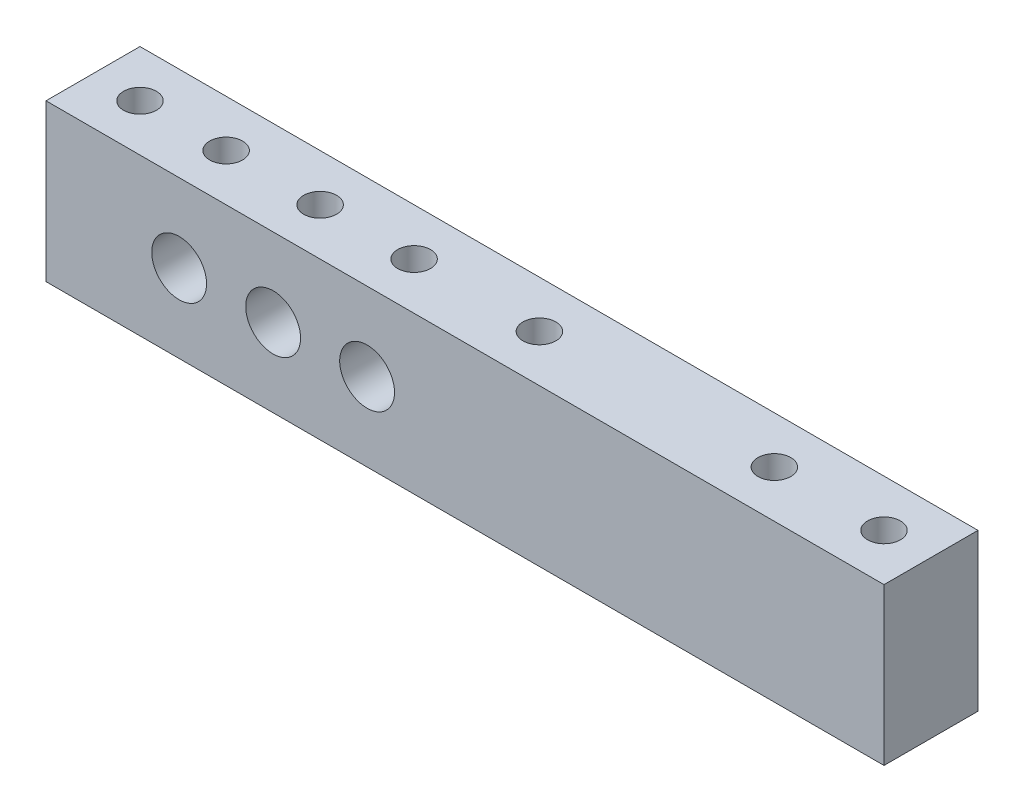
ISO-10303-21;
HEADER;
FILE_DESCRIPTION(('STEP AP214'),'2;1');
FILE_NAME('part.step','',(''),(''),'','','');
FILE_SCHEMA(('AUTOMOTIVE_DESIGN { 1 0 10303 214 1 1 1 1 }'));
ENDSEC;
DATA;
#1=APPLICATION_CONTEXT('core data for automotive mechanical design processes');
#2=APPLICATION_PROTOCOL_DEFINITION('international standard','automotive_design',2000,#1);
#3=PRODUCT_CONTEXT('',#1,'mechanical');
#4=PRODUCT('Part','Part','',(#3));
#5=PRODUCT_RELATED_PRODUCT_CATEGORY('part','',(#4));
#6=PRODUCT_DEFINITION_FORMATION('','',#4);
#7=PRODUCT_DEFINITION_CONTEXT('part definition',#1,'design');
#8=PRODUCT_DEFINITION('design','',#6,#7);
#9=PRODUCT_DEFINITION_SHAPE('','',#8);
#10=(LENGTH_UNIT() NAMED_UNIT(*) SI_UNIT(.MILLI.,.METRE.));
#11=(NAMED_UNIT(*) PLANE_ANGLE_UNIT() SI_UNIT($,.RADIAN.));
#12=(NAMED_UNIT(*) SI_UNIT($,.STERADIAN.) SOLID_ANGLE_UNIT());
#13=UNCERTAINTY_MEASURE_WITH_UNIT(LENGTH_MEASURE(1.E-05),#10,'distance_accuracy_value','');
#14=(GEOMETRIC_REPRESENTATION_CONTEXT(3) GLOBAL_UNCERTAINTY_ASSIGNED_CONTEXT((#13)) GLOBAL_UNIT_ASSIGNED_CONTEXT((#10,
#11,#12)) REPRESENTATION_CONTEXT('',''));
#15=CARTESIAN_POINT('',(0.,0.,0.));
#16=DIRECTION('',(0.,0.,1.));
#17=DIRECTION('',(1.,0.,0.));
#18=AXIS2_PLACEMENT_3D('',#15,#16,#17);
#19=CARTESIAN_POINT('',(0.,0.,12.));
#20=DIRECTION('',(0.,0.,-1.));
#21=DIRECTION('',(-1.,0.,0.));
#22=AXIS2_PLACEMENT_3D('',#19,#20,#21);
#23=PLANE('',#22);
#24=CARTESIAN_POINT('',(29.,10.,12.));
#25=DIRECTION('',(0.,0.,1.));
#26=DIRECTION('',(1.,0.,0.));
#27=AXIS2_PLACEMENT_3D('',#24,#25,#26);
#28=CIRCLE('',#27,3.49999999999999);
#29=CARTESIAN_POINT('',(32.5,10.,12.));
#30=VERTEX_POINT('',#29);
#31=EDGE_CURVE('E245',#30,#30,#28,.T.);
#32=ORIENTED_EDGE('',*,*,#31,.F.);
#33=EDGE_LOOP('',(#32));
#34=FACE_BOUND('',#33,.T.);
#35=CARTESIAN_POINT('',(41.,10.,12.));
#36=DIRECTION('',(0.,0.,1.));
#37=DIRECTION('',(1.,0.,0.));
#38=AXIS2_PLACEMENT_3D('',#35,#36,#37);
#39=CIRCLE('',#38,3.49999999999999);
#40=CARTESIAN_POINT('',(44.5,10.,12.));
#41=VERTEX_POINT('',#40);
#42=EDGE_CURVE('E253',#41,#41,#39,.T.);
#43=ORIENTED_EDGE('',*,*,#42,.F.);
#44=EDGE_LOOP('',(#43));
#45=FACE_BOUND('',#44,.T.);
#46=DIRECTION('',(0.,-1.,0.));
#47=VECTOR('',#46,1.);
#48=CARTESIAN_POINT('',(0.,0.,12.));
#49=LINE('',#48,#47);
#50=CARTESIAN_POINT('',(0.,20.,12.));
#51=VERTEX_POINT('',#50);
#52=CARTESIAN_POINT('',(0.,0.,12.));
#53=VERTEX_POINT('',#52);
#54=EDGE_CURVE('E105',#51,#53,#49,.T.);
#55=ORIENTED_EDGE('',*,*,#54,.T.);
#56=DIRECTION('',(1.,0.,0.));
#57=VECTOR('',#56,1.);
#58=CARTESIAN_POINT('',(0.,0.,12.));
#59=LINE('',#58,#57);
#60=CARTESIAN_POINT('',(107.,0.,12.));
#61=VERTEX_POINT('',#60);
#62=EDGE_CURVE('E100',#53,#61,#59,.T.);
#63=ORIENTED_EDGE('',*,*,#62,.T.);
#64=DIRECTION('',(0.,1.,0.));
#65=VECTOR('',#64,1.);
#66=CARTESIAN_POINT('',(107.,0.,12.));
#67=LINE('',#66,#65);
#68=CARTESIAN_POINT('',(107.,20.,12.));
#69=VERTEX_POINT('',#68);
#70=EDGE_CURVE('E103',#61,#69,#67,.T.);
#71=ORIENTED_EDGE('',*,*,#70,.T.);
#72=DIRECTION('',(-1.,0.,0.));
#73=VECTOR('',#72,1.);
#74=CARTESIAN_POINT('',(0.,20.,12.));
#75=LINE('',#74,#73);
#76=EDGE_CURVE('E70',#69,#51,#75,.T.);
#77=ORIENTED_EDGE('',*,*,#76,.T.);
#78=EDGE_LOOP('',(#55,#63,#71,#77));
#79=FACE_BOUND('',#78,.T.);
#80=CARTESIAN_POINT('',(17.,10.,12.));
#81=DIRECTION('',(0.,0.,1.));
#82=DIRECTION('',(1.,0.,0.));
#83=AXIS2_PLACEMENT_3D('',#80,#81,#82);
#84=CIRCLE('',#83,3.49999999999999);
#85=CARTESIAN_POINT('',(20.5,10.,12.));
#86=VERTEX_POINT('',#85);
#87=EDGE_CURVE('E230',#86,#86,#84,.T.);
#88=ORIENTED_EDGE('',*,*,#87,.F.);
#89=EDGE_LOOP('',(#88));
#90=FACE_BOUND('',#89,.T.);
#91=ADVANCED_FACE('F45',(#34,#45,#79,#90),#23,.F.);
#92=CARTESIAN_POINT('',(0.,0.,12.));
#93=DIRECTION('',(1.,0.,0.));
#94=DIRECTION('',(0.,0.,-1.));
#95=AXIS2_PLACEMENT_3D('',#92,#93,#94);
#96=PLANE('',#95);
#97=DIRECTION('',(0.,-1.,0.));
#98=VECTOR('',#97,1.);
#99=CARTESIAN_POINT('',(0.,0.,0.));
#100=LINE('',#99,#98);
#101=CARTESIAN_POINT('',(0.,20.,0.));
#102=VERTEX_POINT('',#101);
#103=CARTESIAN_POINT('',(0.,0.,0.));
#104=VERTEX_POINT('',#103);
#105=EDGE_CURVE('E122',#102,#104,#100,.T.);
#106=ORIENTED_EDGE('',*,*,#105,.T.);
#107=DIRECTION('',(0.,0.,-1.));
#108=VECTOR('',#107,1.);
#109=CARTESIAN_POINT('',(0.,0.,12.));
#110=LINE('',#109,#108);
#111=EDGE_CURVE('E11',#53,#104,#110,.T.);
#112=ORIENTED_EDGE('',*,*,#111,.F.);
#113=ORIENTED_EDGE('',*,*,#54,.F.);
#114=DIRECTION('',(0.,0.,-1.));
#115=VECTOR('',#114,1.);
#116=CARTESIAN_POINT('',(0.,20.,12.));
#117=LINE('',#116,#115);
#118=EDGE_CURVE('E118',#51,#102,#117,.T.);
#119=ORIENTED_EDGE('',*,*,#118,.T.);
#120=EDGE_LOOP('',(#106,#112,#113,#119));
#121=FACE_BOUND('',#120,.T.);
#122=ADVANCED_FACE('F47',(#121),#96,.F.);
#123=CARTESIAN_POINT('',(0.,0.,12.));
#124=DIRECTION('',(0.,1.,0.));
#125=DIRECTION('',(0.,0.,1.));
#126=AXIS2_PLACEMENT_3D('',#123,#124,#125);
#127=PLANE('',#126);
#128=CARTESIAN_POINT('',(6.00000000000001,0.,6.));
#129=DIRECTION('',(0.,1.,0.));
#130=DIRECTION('',(0.,0.,1.));
#131=AXIS2_PLACEMENT_3D('',#128,#129,#130);
#132=CIRCLE('',#131,2.09999999999999);
#133=CARTESIAN_POINT('',(6.00000000000001,0.,8.09999999999999));
#134=VERTEX_POINT('',#133);
#135=EDGE_CURVE('E217',#134,#134,#132,.T.);
#136=ORIENTED_EDGE('',*,*,#135,.T.);
#137=EDGE_LOOP('',(#136));
#138=FACE_BOUND('',#137,.T.);
#139=CARTESIAN_POINT('',(101.,0.,6.));
#140=DIRECTION('',(0.,1.,0.));
#141=DIRECTION('',(0.,0.,1.));
#142=AXIS2_PLACEMENT_3D('',#139,#140,#141);
#143=CIRCLE('',#142,2.09999999999999);
#144=CARTESIAN_POINT('',(101.,0.,8.09999999999999));
#145=VERTEX_POINT('',#144);
#146=EDGE_CURVE('E221',#145,#145,#143,.T.);
#147=ORIENTED_EDGE('',*,*,#146,.T.);
#148=EDGE_LOOP('',(#147));
#149=FACE_BOUND('',#148,.T.);
#150=CARTESIAN_POINT('',(87.,0.,6.));
#151=DIRECTION('',(0.,1.,0.));
#152=DIRECTION('',(0.,0.,1.));
#153=AXIS2_PLACEMENT_3D('',#150,#151,#152);
#154=CIRCLE('',#153,2.09999999999999);
#155=CARTESIAN_POINT('',(87.,0.,8.09999999999999));
#156=VERTEX_POINT('',#155);
#157=EDGE_CURVE('E225',#156,#156,#154,.T.);
#158=ORIENTED_EDGE('',*,*,#157,.T.);
#159=EDGE_LOOP('',(#158));
#160=FACE_BOUND('',#159,.T.);
#161=CARTESIAN_POINT('',(57.,0.,6.));
#162=DIRECTION('',(0.,1.,0.));
#163=DIRECTION('',(0.,0.,1.));
#164=AXIS2_PLACEMENT_3D('',#161,#162,#163);
#165=CIRCLE('',#164,2.09999999999999);
#166=CARTESIAN_POINT('',(57.,0.,8.09999999999999));
#167=VERTEX_POINT('',#166);
#168=EDGE_CURVE('E228',#167,#167,#165,.T.);
#169=ORIENTED_EDGE('',*,*,#168,.T.);
#170=EDGE_LOOP('',(#169));
#171=FACE_BOUND('',#170,.T.);
#172=DIRECTION('',(1.,0.,0.));
#173=VECTOR('',#172,1.);
#174=CARTESIAN_POINT('',(0.,0.,0.));
#175=LINE('',#174,#173);
#176=CARTESIAN_POINT('',(107.,0.,0.));
#177=VERTEX_POINT('',#176);
#178=EDGE_CURVE('E110',#104,#177,#175,.T.);
#179=ORIENTED_EDGE('',*,*,#178,.T.);
#180=DIRECTION('',(0.,0.,-1.));
#181=VECTOR('',#180,1.);
#182=CARTESIAN_POINT('',(107.,0.,12.));
#183=LINE('',#182,#181);
#184=EDGE_CURVE('E61',#61,#177,#183,.T.);
#185=ORIENTED_EDGE('',*,*,#184,.F.);
#186=ORIENTED_EDGE('',*,*,#62,.F.);
#187=ORIENTED_EDGE('',*,*,#111,.T.);
#188=EDGE_LOOP('',(#179,#185,#186,#187));
#189=FACE_BOUND('',#188,.T.);
#190=ADVANCED_FACE('F109',(#138,#149,#160,#171,#189),#127,.F.);
#191=CARTESIAN_POINT('',(107.,0.,12.));
#192=DIRECTION('',(-1.,0.,0.));
#193=DIRECTION('',(0.,0.,1.));
#194=AXIS2_PLACEMENT_3D('',#191,#192,#193);
#195=PLANE('',#194);
#196=DIRECTION('',(0.,1.,0.));
#197=VECTOR('',#196,1.);
#198=CARTESIAN_POINT('',(107.,0.,0.));
#199=LINE('',#198,#197);
#200=CARTESIAN_POINT('',(107.,20.,0.));
#201=VERTEX_POINT('',#200);
#202=EDGE_CURVE('E87',#177,#201,#199,.T.);
#203=ORIENTED_EDGE('',*,*,#202,.T.);
#204=DIRECTION('',(0.,0.,-1.));
#205=VECTOR('',#204,1.);
#206=CARTESIAN_POINT('',(107.,20.,12.));
#207=LINE('',#206,#205);
#208=EDGE_CURVE('E112',#69,#201,#207,.T.);
#209=ORIENTED_EDGE('',*,*,#208,.F.);
#210=ORIENTED_EDGE('',*,*,#70,.F.);
#211=ORIENTED_EDGE('',*,*,#184,.T.);
#212=EDGE_LOOP('',(#203,#209,#210,#211));
#213=FACE_BOUND('',#212,.T.);
#214=ADVANCED_FACE('F114',(#213),#195,.F.);
#215=CARTESIAN_POINT('',(0.,20.,12.));
#216=DIRECTION('',(0.,-1.,0.));
#217=DIRECTION('',(0.,0.,-1.));
#218=AXIS2_PLACEMENT_3D('',#215,#216,#217);
#219=PLANE('',#218);
#220=CARTESIAN_POINT('',(17.,20.,6.));
#221=DIRECTION('',(0.,1.,0.));
#222=DIRECTION('',(0.,0.,1.));
#223=AXIS2_PLACEMENT_3D('',#220,#221,#222);
#224=CIRCLE('',#223,2.09999999999999);
#225=CARTESIAN_POINT('',(17.,20.,8.09999999999999));
#226=VERTEX_POINT('',#225);
#227=EDGE_CURVE('E296',#226,#226,#224,.T.);
#228=ORIENTED_EDGE('',*,*,#227,.F.);
#229=EDGE_LOOP('',(#228));
#230=FACE_BOUND('',#229,.T.);
#231=CARTESIAN_POINT('',(29.,20.,6.));
#232=DIRECTION('',(0.,1.,0.));
#233=DIRECTION('',(0.,0.,1.));
#234=AXIS2_PLACEMENT_3D('',#231,#232,#233);
#235=CIRCLE('',#234,2.09999999999999);
#236=CARTESIAN_POINT('',(29.,20.,8.09999999999999));
#237=VERTEX_POINT('',#236);
#238=EDGE_CURVE('E292',#237,#237,#235,.T.);
#239=ORIENTED_EDGE('',*,*,#238,.F.);
#240=EDGE_LOOP('',(#239));
#241=FACE_BOUND('',#240,.T.);
#242=CARTESIAN_POINT('',(41.,20.,6.));
#243=DIRECTION('',(0.,1.,0.));
#244=DIRECTION('',(0.,0.,1.));
#245=AXIS2_PLACEMENT_3D('',#242,#243,#244);
#246=CIRCLE('',#245,2.09999999999999);
#247=CARTESIAN_POINT('',(41.,20.,8.09999999999999));
#248=VERTEX_POINT('',#247);
#249=EDGE_CURVE('E146',#248,#248,#246,.T.);
#250=ORIENTED_EDGE('',*,*,#249,.F.);
#251=EDGE_LOOP('',(#250));
#252=FACE_BOUND('',#251,.T.);
#253=CARTESIAN_POINT('',(6.00000000000001,20.,6.));
#254=DIRECTION('',(0.,1.,0.));
#255=DIRECTION('',(0.,0.,1.));
#256=AXIS2_PLACEMENT_3D('',#253,#254,#255);
#257=CIRCLE('',#256,2.09999999999999);
#258=CARTESIAN_POINT('',(6.00000000000001,20.,8.09999999999999));
#259=VERTEX_POINT('',#258);
#260=EDGE_CURVE('E145',#259,#259,#257,.T.);
#261=ORIENTED_EDGE('',*,*,#260,.F.);
#262=EDGE_LOOP('',(#261));
#263=FACE_BOUND('',#262,.T.);
#264=CARTESIAN_POINT('',(101.,20.,6.));
#265=DIRECTION('',(0.,1.,0.));
#266=DIRECTION('',(0.,0.,1.));
#267=AXIS2_PLACEMENT_3D('',#264,#265,#266);
#268=CIRCLE('',#267,2.09999999999999);
#269=CARTESIAN_POINT('',(101.,20.,8.09999999999999));
#270=VERTEX_POINT('',#269);
#271=EDGE_CURVE('E280',#270,#270,#268,.T.);
#272=ORIENTED_EDGE('',*,*,#271,.F.);
#273=EDGE_LOOP('',(#272));
#274=FACE_BOUND('',#273,.T.);
#275=CARTESIAN_POINT('',(87.,20.,6.));
#276=DIRECTION('',(0.,1.,0.));
#277=DIRECTION('',(0.,0.,1.));
#278=AXIS2_PLACEMENT_3D('',#275,#276,#277);
#279=CIRCLE('',#278,2.09999999999999);
#280=CARTESIAN_POINT('',(87.,20.,8.09999999999999));
#281=VERTEX_POINT('',#280);
#282=EDGE_CURVE('E274',#281,#281,#279,.T.);
#283=ORIENTED_EDGE('',*,*,#282,.F.);
#284=EDGE_LOOP('',(#283));
#285=FACE_BOUND('',#284,.T.);
#286=CARTESIAN_POINT('',(57.,20.,6.));
#287=DIRECTION('',(0.,1.,0.));
#288=DIRECTION('',(0.,0.,1.));
#289=AXIS2_PLACEMENT_3D('',#286,#287,#288);
#290=CIRCLE('',#289,2.09999999999999);
#291=CARTESIAN_POINT('',(57.,20.,8.09999999999999));
#292=VERTEX_POINT('',#291);
#293=EDGE_CURVE('E231',#292,#292,#290,.T.);
#294=ORIENTED_EDGE('',*,*,#293,.F.);
#295=EDGE_LOOP('',(#294));
#296=FACE_BOUND('',#295,.T.);
#297=DIRECTION('',(-1.,0.,0.));
#298=VECTOR('',#297,1.);
#299=CARTESIAN_POINT('',(0.,20.,0.));
#300=LINE('',#299,#298);
#301=EDGE_CURVE('E93',#201,#102,#300,.T.);
#302=ORIENTED_EDGE('',*,*,#301,.T.);
#303=ORIENTED_EDGE('',*,*,#118,.F.);
#304=ORIENTED_EDGE('',*,*,#76,.F.);
#305=ORIENTED_EDGE('',*,*,#208,.T.);
#306=EDGE_LOOP('',(#302,#303,#304,#305));
#307=FACE_BOUND('',#306,.T.);
#308=ADVANCED_FACE('F204',(#230,#241,#252,#263,#274,#285,#296,#307),#219,.F.);
#309=CARTESIAN_POINT('',(0.,0.,0.));
#310=DIRECTION('',(0.,0.,-1.));
#311=DIRECTION('',(-1.,0.,0.));
#312=AXIS2_PLACEMENT_3D('',#309,#310,#311);
#313=PLANE('',#312);
#314=CARTESIAN_POINT('',(17.,10.,0.));
#315=DIRECTION('',(0.,0.,-1.));
#316=DIRECTION('',(-1.,0.,0.));
#317=AXIS2_PLACEMENT_3D('',#314,#315,#316);
#318=CIRCLE('',#317,3.49999999999999);
#319=CARTESIAN_POINT('',(13.5,10.,0.));
#320=VERTEX_POINT('',#319);
#321=EDGE_CURVE('E236',#320,#320,#318,.T.);
#322=ORIENTED_EDGE('',*,*,#321,.F.);
#323=EDGE_LOOP('',(#322));
#324=FACE_BOUND('',#323,.T.);
#325=CARTESIAN_POINT('',(29.,10.,0.));
#326=DIRECTION('',(0.,0.,-1.));
#327=DIRECTION('',(-1.,0.,0.));
#328=AXIS2_PLACEMENT_3D('',#325,#326,#327);
#329=CIRCLE('',#328,3.49999999999999);
#330=CARTESIAN_POINT('',(25.5,10.,0.));
#331=VERTEX_POINT('',#330);
#332=EDGE_CURVE('E249',#331,#331,#329,.T.);
#333=ORIENTED_EDGE('',*,*,#332,.F.);
#334=EDGE_LOOP('',(#333));
#335=FACE_BOUND('',#334,.T.);
#336=CARTESIAN_POINT('',(41.,10.,0.));
#337=DIRECTION('',(0.,0.,-1.));
#338=DIRECTION('',(-1.,0.,0.));
#339=AXIS2_PLACEMENT_3D('',#336,#337,#338);
#340=CIRCLE('',#339,3.49999999999999);
#341=CARTESIAN_POINT('',(37.5,10.,0.));
#342=VERTEX_POINT('',#341);
#343=EDGE_CURVE('E126',#342,#342,#340,.T.);
#344=ORIENTED_EDGE('',*,*,#343,.F.);
#345=EDGE_LOOP('',(#344));
#346=FACE_BOUND('',#345,.T.);
#347=ORIENTED_EDGE('',*,*,#105,.F.);
#348=ORIENTED_EDGE('',*,*,#301,.F.);
#349=ORIENTED_EDGE('',*,*,#202,.F.);
#350=ORIENTED_EDGE('',*,*,#178,.F.);
#351=EDGE_LOOP('',(#347,#348,#349,#350));
#352=FACE_BOUND('',#351,.T.);
#353=ADVANCED_FACE('F189',(#324,#335,#346,#352),#313,.T.);
#354=CARTESIAN_POINT('',(41.,10.,12.));
#355=DIRECTION('',(0.,0.,1.));
#356=DIRECTION('',(1.,0.,0.));
#357=AXIS2_PLACEMENT_3D('',#354,#355,#356);
#358=CYLINDRICAL_SURFACE('',#357,3.49999999999999);
#359=CARTESIAN_POINT('',(41.,13.5,8.09999999999999));
#360=CARTESIAN_POINT('',(41.1074197899092,13.4999939528958,8.09999333337257));
#361=CARTESIAN_POINT('',(41.2150147186573,13.4950004478493,8.09169960879195));
#362=CARTESIAN_POINT('',(41.4269662448967,13.475498867816,8.0589462052118));
#363=CARTESIAN_POINT('',(41.5313141905622,13.460967330559,8.03444666092683));
#364=CARTESIAN_POINT('',(41.7332524174783,13.4238617549475,7.97065902717563));
#365=CARTESIAN_POINT('',(41.8308734015319,13.4013276102931,7.93144424052535));
#366=CARTESIAN_POINT('',(42.0178424834763,13.350135162294,7.8397955516443));
#367=CARTESIAN_POINT('',(42.1071926277086,13.3214783796264,7.78736493124435));
#368=CARTESIAN_POINT('',(42.2828189792684,13.2578750454353,7.66631523722498));
#369=CARTESIAN_POINT('',(42.3683376250646,13.2226150894972,7.59676482505933));
#370=CARTESIAN_POINT('',(42.5272357888198,13.150426151163,7.445545916091));
#371=CARTESIAN_POINT('',(42.6005994901348,13.1134950725021,7.36386188834691));
#372=CARTESIAN_POINT('',(42.7422299537148,13.0367549375475,7.17890708484524));
#373=CARTESIAN_POINT('',(42.8087687290468,12.9971482477462,7.07421752050433));
#374=CARTESIAN_POINT('',(42.9230601289646,12.9251362198744,6.8528147975813));
#375=CARTESIAN_POINT('',(42.970843242752,12.8927192318596,6.73612154528181));
#376=CARTESIAN_POINT('',(43.0361684239538,12.8469648152345,6.52276496906392));
#377=CARTESIAN_POINT('',(43.0582267614434,12.8309103639213,6.42806960193979));
#378=CARTESIAN_POINT('',(43.0890264127788,12.808264316142,6.23547479784325));
#379=CARTESIAN_POINT('',(43.0977842837989,12.801660955014,6.13757949974526));
#380=CARTESIAN_POINT('',(43.1014771231409,12.7988929144926,5.94118390809419));
#381=CARTESIAN_POINT('',(43.096384967717,12.8027487181777,5.84268280486912));
#382=CARTESIAN_POINT('',(43.0726448467044,12.8203456602127,5.6482097144018));
#383=CARTESIAN_POINT('',(43.0539866846817,12.8340942340512,5.55223968581369));
#384=CARTESIAN_POINT('',(43.0044349063449,12.8693446172195,5.36645766102055));
#385=CARTESIAN_POINT('',(42.9737024813251,12.8907439631355,5.2765821245057));
#386=CARTESIAN_POINT('',(42.9011308647918,12.9389787189116,5.10302701270066));
#387=CARTESIAN_POINT('',(42.8592876016359,12.9658161207285,5.01934972320652));
#388=CARTESIAN_POINT('',(42.7572517645841,13.0275745817658,4.84502226402807));
#389=CARTESIAN_POINT('',(42.6951301415681,13.0630886072219,4.75571066986311));
#390=CARTESIAN_POINT('',(42.558075298976,13.1350283967013,4.58785292286619));
#391=CARTESIAN_POINT('',(42.4831298314081,13.1714550036701,4.5093171924329));
#392=CARTESIAN_POINT('',(42.3101365681362,13.2470970694164,4.35414182544955));
#393=CARTESIAN_POINT('',(42.2103247557869,13.2859937077594,4.27929177157762));
#394=CARTESIAN_POINT('',(41.9971864706426,13.3568139980757,4.14762913392294));
#395=CARTESIAN_POINT('',(41.883867269521,13.3887413759572,4.09080690469408));
#396=CARTESIAN_POINT('',(41.6540766193755,13.4402254889261,4.00089494408575));
#397=CARTESIAN_POINT('',(41.538254673843,13.4604354041558,3.96653450199773));
#398=CARTESIAN_POINT('',(41.3010670532025,13.4890637993897,3.91818432363248));
#399=CARTESIAN_POINT('',(41.1797082079258,13.4974964213383,3.904170155145));
#400=CARTESIAN_POINT('',(40.9527995398716,13.5012679852445,3.89788901325038));
#401=CARTESIAN_POINT('',(40.8473405372138,13.498229304,3.90292760288077));
#402=CARTESIAN_POINT('',(40.6390388372195,13.4829019692187,3.9285961943007));
#403=CARTESIAN_POINT('',(40.5361960868734,13.4706135032525,3.94922587992814));
#404=CARTESIAN_POINT('',(40.3383950949794,13.4383270941907,4.00436080593746));
#405=CARTESIAN_POINT('',(40.2433059487002,13.4185238592758,4.03851648870287));
#406=CARTESIAN_POINT('',(40.0602279512778,13.3727943320798,4.11934832691138));
#407=CARTESIAN_POINT('',(39.9722405050502,13.3468668322111,4.16602695188532));
#408=CARTESIAN_POINT('',(39.7959912320469,13.287836947323,4.27597977089222));
#409=CARTESIAN_POINT('',(39.7086481893617,13.2542692383583,4.34047336070987));
#410=CARTESIAN_POINT('',(39.5453635561645,13.1846397180462,4.48154795088396));
#411=CARTESIAN_POINT('',(39.4694354361628,13.148575032209,4.55814301679315));
#412=CARTESIAN_POINT('',(39.3209520457074,13.0722359347385,4.73287454605247));
#413=CARTESIAN_POINT('',(39.2501257251889,13.0320253844484,4.83251743965351));
#414=CARTESIAN_POINT('',(39.126166655159,12.9570265489336,5.04410243439368));
#415=CARTESIAN_POINT('',(39.073015265142,12.9222325719666,5.15603141144314));
#416=CARTESIAN_POINT('',(38.9960038969227,12.8697887293681,5.36474023123467));
#417=CARTESIAN_POINT('',(38.9682972455069,12.850059230605,5.45957243731982));
#418=CARTESIAN_POINT('',(38.9264087051031,12.8197344804068,5.65354490929438));
#419=CARTESIAN_POINT('',(38.9122080650441,12.8091265669878,5.75267900199321));
#420=CARTESIAN_POINT('',(38.8981221749593,12.798606252638,5.95292772670185));
#421=CARTESIAN_POINT('',(38.8982907554492,12.7987340702815,6.05404838720846));
#422=CARTESIAN_POINT('',(38.9130693756084,12.8097680504614,6.25465220960651));
#423=CARTESIAN_POINT('',(38.9276872679251,12.8206800737999,6.35413445119172));
#424=CARTESIAN_POINT('',(38.9694375724369,12.8508645935384,6.54388378547779));
#425=CARTESIAN_POINT('',(38.9959331225554,12.8697089657767,6.63436393522854));
#426=CARTESIAN_POINT('',(39.0601145725173,12.9134770269434,6.80967215306377));
#427=CARTESIAN_POINT('',(39.0978046866429,12.9384030047082,6.89449807781923));
#428=CARTESIAN_POINT('',(39.1899507273115,12.9961818698568,7.07004781386559));
#429=CARTESIAN_POINT('',(39.2460923124976,13.0296642347273,7.15967760038798));
#430=CARTESIAN_POINT('',(39.3707395620492,13.0984817698533,7.32913204662679));
#431=CARTESIAN_POINT('',(39.4392554077491,13.1338184486937,7.40894854055222));
#432=CARTESIAN_POINT('',(39.5998659983072,13.2091597015105,7.56989156895338));
#433=CARTESIAN_POINT('',(39.6939840293885,13.2489844716257,7.64910446947699));
#434=CARTESIAN_POINT('',(39.8961410112056,13.3231158538248,7.7907360332411));
#435=CARTESIAN_POINT('',(40.0041849314581,13.3574204861488,7.85314867655894));
#436=CARTESIAN_POINT('',(40.2284667938247,13.4157986481033,7.95690364005775));
#437=CARTESIAN_POINT('',(40.3443528860365,13.4401530976888,7.99883220714115));
#438=CARTESIAN_POINT('',(40.5233150641175,13.4679159327653,8.04611603861514));
#439=CARTESIAN_POINT('',(40.5837582613917,13.4757051316474,8.05927014237676));
#440=CARTESIAN_POINT('',(40.7058668697327,13.4881564100136,8.08021866245479));
#441=CARTESIAN_POINT('',(40.7675312186793,13.4928210938675,8.08801754263529));
#442=CARTESIAN_POINT('',(40.8578140345817,13.4972261237468,8.09537423707465));
#443=CARTESIAN_POINT('',(40.8862119489171,13.498265078481,8.09710757210829));
#444=CARTESIAN_POINT('',(40.9430691395261,13.4996528299694,8.09942135706067));
#445=CARTESIAN_POINT('',(40.9715284178941,13.5000016027831,8.10000176698753));
#446=CARTESIAN_POINT('',(41.,13.5,8.09999999999999));
#447=B_SPLINE_CURVE_WITH_KNOTS('',3,(#359,#360,#361,#362,#363,#364,#365,#366,#367,#368,#369,
#370,#371,#372,#373,#374,#375,#376,#377,#378,#379,#380,#381,#382,#383,#384,#385,#386,#387,#388,
#389,#390,#391,#392,#393,#394,#395,#396,#397,#398,#399,#400,#401,#402,#403,#404,#405,#406,#407,
#408,#409,#410,#411,#412,#413,#414,#415,#416,#417,#418,#419,#420,#421,#422,#423,#424,#425,#426,
#427,#428,#429,#430,#431,#432,#433,#434,#435,#436,#437,#438,#439,#440,#441,#442,#443,#444,#445,
#446),.UNSPECIFIED.,.T.,.F.,(4,2,2,2,2,2,2,2,2,2,2,2,2,2,2,2,2,2,2,2,2,2,2,2,2,2,2,2,2,2,2,2,2,
2,2,2,2,2,2,2,2,2,2,4),(0.,0.322143132568111,0.645081678528012,0.966432438440011,
1.28770347718918,1.63354227025461,1.9798276110872,2.36857338465729,2.75668456968927,
3.05107361797885,3.34509589283207,3.63969439219014,3.93451454583419,4.22552574630487,
4.51664373733814,4.85865793315225,5.20100062725141,5.59105341038565,5.98089714985451,
6.3461550697518,6.71097401685528,7.02625843811393,7.34153646608834,7.64914899965676,
7.95682223922632,8.29641912145702,8.63641366114566,9.02071467399208,9.40460909663034,
9.70560902240565,10.0061904422664,10.307897960884,10.6097695361801,10.8970973766359,
11.1845335213224,11.516100540732,11.8479416211829,12.2339603648572,12.6201172444477,
12.9944591624774,13.1812369971001,13.3678589528368,13.453239928947,13.5386238666415),.UNSPECIFIED.);
#448=CARTESIAN_POINT('',(41.,13.5,8.09999999999999));
#449=VERTEX_POINT('',#448);
#450=EDGE_CURVE('E137',#449,#449,#447,.T.);
#451=ORIENTED_EDGE('',*,*,#450,.T.);
#452=EDGE_LOOP('',(#451));
#453=FACE_BOUND('',#452,.T.);
#454=ORIENTED_EDGE('',*,*,#42,.T.);
#455=EDGE_LOOP('',(#454));
#456=FACE_BOUND('',#455,.T.);
#457=ORIENTED_EDGE('',*,*,#343,.T.);
#458=EDGE_LOOP('',(#457));
#459=FACE_BOUND('',#458,.T.);
#460=ADVANCED_FACE('F153',(#453,#456,#459),#358,.F.);
#461=CARTESIAN_POINT('',(29.,10.,12.));
#462=DIRECTION('',(0.,0.,1.));
#463=DIRECTION('',(1.,0.,0.));
#464=AXIS2_PLACEMENT_3D('',#461,#462,#463);
#465=CYLINDRICAL_SURFACE('',#464,3.49999999999999);
#466=CARTESIAN_POINT('',(29.,13.5,8.09999999999999));
#467=CARTESIAN_POINT('',(29.1074197899092,13.4999939528958,8.09999333337256));
#468=CARTESIAN_POINT('',(29.2150147186573,13.4950004478493,8.09169960879195));
#469=CARTESIAN_POINT('',(29.4269662448967,13.475498867816,8.0589462052118));
#470=CARTESIAN_POINT('',(29.5313141905622,13.460967330559,8.03444666092682));
#471=CARTESIAN_POINT('',(29.7332524174783,13.4238617549475,7.97065902717562));
#472=CARTESIAN_POINT('',(29.8308734015319,13.4013276102931,7.93144424052535));
#473=CARTESIAN_POINT('',(30.0178424834763,13.350135162294,7.83979555164429));
#474=CARTESIAN_POINT('',(30.1071926277086,13.3214783796264,7.78736493124435));
#475=CARTESIAN_POINT('',(30.2828189792684,13.2578750454353,7.66631523722497));
#476=CARTESIAN_POINT('',(30.3683376250646,13.2226150894972,7.59676482505933));
#477=CARTESIAN_POINT('',(30.5272357888198,13.150426151163,7.44554591609099));
#478=CARTESIAN_POINT('',(30.6005994901348,13.1134950725021,7.36386188834691));
#479=CARTESIAN_POINT('',(30.7422299537148,13.0367549375475,7.17890708484523));
#480=CARTESIAN_POINT('',(30.8087687290468,12.9971482477462,7.07421752050433));
#481=CARTESIAN_POINT('',(30.9230601289646,12.9251362198744,6.85281479758129));
#482=CARTESIAN_POINT('',(30.970843242752,12.8927192318596,6.73612154528179));
#483=CARTESIAN_POINT('',(31.0361684239537,12.8469648152345,6.52276496906391));
#484=CARTESIAN_POINT('',(31.0582267614434,12.8309103639213,6.42806960193978));
#485=CARTESIAN_POINT('',(31.0890264127788,12.808264316142,6.23547479784324));
#486=CARTESIAN_POINT('',(31.0977842837989,12.801660955014,6.13757949974525));
#487=CARTESIAN_POINT('',(31.1014771231408,12.7988929144926,5.94118390809417));
#488=CARTESIAN_POINT('',(31.096384967717,12.8027487181777,5.8426828048691));
#489=CARTESIAN_POINT('',(31.0726448467044,12.8203456602127,5.64820971440179));
#490=CARTESIAN_POINT('',(31.0539866846817,12.8340942340513,5.55223968581368));
#491=CARTESIAN_POINT('',(31.0044349063448,12.8693446172195,5.36645766102054));
#492=CARTESIAN_POINT('',(30.9737024813251,12.8907439631355,5.27658212450569));
#493=CARTESIAN_POINT('',(30.9011308647918,12.9389787189116,5.10302701270065));
#494=CARTESIAN_POINT('',(30.8592876016359,12.9658161207285,5.01934972320651));
#495=CARTESIAN_POINT('',(30.7572517645841,13.0275745817658,4.84502226402807));
#496=CARTESIAN_POINT('',(30.6951301415681,13.0630886072219,4.7557106698631));
#497=CARTESIAN_POINT('',(30.558075298976,13.1350283967013,4.58785292286618));
#498=CARTESIAN_POINT('',(30.4831298314081,13.1714550036701,4.50931719243289));
#499=CARTESIAN_POINT('',(30.3101365681361,13.2470970694164,4.35414182544954));
#500=CARTESIAN_POINT('',(30.2103247557869,13.2859937077594,4.27929177157762));
#501=CARTESIAN_POINT('',(29.9971864706426,13.3568139980757,4.14762913392293));
#502=CARTESIAN_POINT('',(29.883867269521,13.3887413759572,4.09080690469407));
#503=CARTESIAN_POINT('',(29.6540766193755,13.4402254889261,4.00089494408575));
#504=CARTESIAN_POINT('',(29.538254673843,13.4604354041558,3.96653450199773));
#505=CARTESIAN_POINT('',(29.3010670532025,13.4890637993897,3.91818432363248));
#506=CARTESIAN_POINT('',(29.1797082079258,13.4974964213383,3.90417015514501));
#507=CARTESIAN_POINT('',(28.9527995398716,13.5012679852445,3.89788901325038));
#508=CARTESIAN_POINT('',(28.8473405372138,13.498229304,3.90292760288077));
#509=CARTESIAN_POINT('',(28.6390388372195,13.4829019692187,3.9285961943007));
#510=CARTESIAN_POINT('',(28.5361960868734,13.4706135032525,3.94922587992815));
#511=CARTESIAN_POINT('',(28.3383950949794,13.4383270941907,4.00436080593746));
#512=CARTESIAN_POINT('',(28.2433059487002,13.4185238592758,4.03851648870288));
#513=CARTESIAN_POINT('',(28.0602279512778,13.3727943320798,4.11934832691138));
#514=CARTESIAN_POINT('',(27.9722405050502,13.3468668322111,4.16602695188533));
#515=CARTESIAN_POINT('',(27.7959912320469,13.287836947323,4.27597977089223));
#516=CARTESIAN_POINT('',(27.7086481893617,13.2542692383583,4.34047336070988));
#517=CARTESIAN_POINT('',(27.5453635561645,13.1846397180462,4.48154795088397));
#518=CARTESIAN_POINT('',(27.4694354361628,13.148575032209,4.55814301679316));
#519=CARTESIAN_POINT('',(27.3209520457074,13.0722359347385,4.73287454605249));
#520=CARTESIAN_POINT('',(27.2501257251889,13.0320253844483,4.83251743965353));
#521=CARTESIAN_POINT('',(27.126166655159,12.9570265489336,5.0441024343937));
#522=CARTESIAN_POINT('',(27.073015265142,12.9222325719666,5.15603141144316));
#523=CARTESIAN_POINT('',(26.9960038969227,12.8697887293681,5.36474023123468));
#524=CARTESIAN_POINT('',(26.9682972455069,12.850059230605,5.45957243731984));
#525=CARTESIAN_POINT('',(26.9264087051031,12.8197344804068,5.65354490929439));
#526=CARTESIAN_POINT('',(26.9122080650441,12.8091265669878,5.75267900199322));
#527=CARTESIAN_POINT('',(26.8981221749593,12.798606252638,5.95292772670186));
#528=CARTESIAN_POINT('',(26.8982907554492,12.7987340702815,6.05404838720847));
#529=CARTESIAN_POINT('',(26.9130693756084,12.8097680504614,6.25465220960653));
#530=CARTESIAN_POINT('',(26.9276872679251,12.8206800737999,6.35413445119173));
#531=CARTESIAN_POINT('',(26.9694375724369,12.8508645935384,6.5438837854778));
#532=CARTESIAN_POINT('',(26.9959331225554,12.8697089657767,6.63436393522855));
#533=CARTESIAN_POINT('',(27.0601145725174,12.9134770269434,6.80967215306378));
#534=CARTESIAN_POINT('',(27.0978046866429,12.9384030047082,6.89449807781924));
#535=CARTESIAN_POINT('',(27.1899507273115,12.9961818698568,7.0700478138656));
#536=CARTESIAN_POINT('',(27.2460923124976,13.0296642347273,7.15967760038799));
#537=CARTESIAN_POINT('',(27.3707395620492,13.0984817698533,7.3291320466268));
#538=CARTESIAN_POINT('',(27.4392554077491,13.1338184486937,7.40894854055223));
#539=CARTESIAN_POINT('',(27.5998659983072,13.2091597015106,7.56989156895338));
#540=CARTESIAN_POINT('',(27.6939840293885,13.2489844716257,7.649104469477));
#541=CARTESIAN_POINT('',(27.8961410112056,13.3231158538248,7.7907360332411));
#542=CARTESIAN_POINT('',(28.0041849314581,13.3574204861488,7.85314867655895));
#543=CARTESIAN_POINT('',(28.2284667938247,13.4157986481033,7.95690364005775));
#544=CARTESIAN_POINT('',(28.3443528860366,13.4401530976888,7.99883220714116));
#545=CARTESIAN_POINT('',(28.5233150641175,13.4679159327653,8.04611603861514));
#546=CARTESIAN_POINT('',(28.5837582613917,13.4757051316475,8.05927014237677));
#547=CARTESIAN_POINT('',(28.7058668697327,13.4881564100136,8.08021866245479));
#548=CARTESIAN_POINT('',(28.7675312186794,13.4928210938675,8.08801754263529));
#549=CARTESIAN_POINT('',(28.8578140345818,13.4972261237468,8.09537423707464));
#550=CARTESIAN_POINT('',(28.8862119489171,13.498265078481,8.09710757210829));
#551=CARTESIAN_POINT('',(28.9430691395261,13.4996528299694,8.09942135706066));
#552=CARTESIAN_POINT('',(28.9715284178941,13.5000016027831,8.10000176698752));
#553=CARTESIAN_POINT('',(29.,13.5,8.09999999999999));
#554=B_SPLINE_CURVE_WITH_KNOTS('',3,(#466,#467,#468,#469,#470,#471,#472,#473,#474,#475,#476,
#477,#478,#479,#480,#481,#482,#483,#484,#485,#486,#487,#488,#489,#490,#491,#492,#493,#494,#495,
#496,#497,#498,#499,#500,#501,#502,#503,#504,#505,#506,#507,#508,#509,#510,#511,#512,#513,#514,
#515,#516,#517,#518,#519,#520,#521,#522,#523,#524,#525,#526,#527,#528,#529,#530,#531,#532,#533,
#534,#535,#536,#537,#538,#539,#540,#541,#542,#543,#544,#545,#546,#547,#548,#549,#550,#551,#552,
#553),.UNSPECIFIED.,.T.,.F.,(4,2,2,2,2,2,2,2,2,2,2,2,2,2,2,2,2,2,2,2,2,2,2,2,2,2,2,2,2,2,2,2,2,
2,2,2,2,2,2,2,2,2,2,4),(0.,0.322143132568111,0.645081678528015,0.966432438440011,
1.28770347718918,1.63354227025461,1.9798276110872,2.36857338465729,2.75668456968927,
3.05107361797885,3.34509589283208,3.63969439219015,3.9345145458342,4.22552574630488,
4.51664373733814,4.85865793315226,5.20100062725142,5.59105341038565,5.98089714985451,
6.3461550697518,6.71097401685527,7.02625843811393,7.34153646608833,7.64914899965676,
7.95682223922631,8.29641912145702,8.63641366114566,9.02071467399208,9.40460909663033,
9.70560902240564,10.0061904422664,10.307897960884,10.6097695361801,10.8970973766359,
11.1845335213224,11.5161005407319,11.8479416211828,12.2339603648572,12.6201172444477,
12.9944591624774,13.1812369971,13.3678589528368,13.453239928947,13.5386238666415),.UNSPECIFIED.);
#555=CARTESIAN_POINT('',(29.,13.5,8.09999999999999));
#556=VERTEX_POINT('',#555);
#557=EDGE_CURVE('E147',#556,#556,#554,.T.);
#558=ORIENTED_EDGE('',*,*,#557,.T.);
#559=EDGE_LOOP('',(#558));
#560=FACE_BOUND('',#559,.T.);
#561=ORIENTED_EDGE('',*,*,#31,.T.);
#562=EDGE_LOOP('',(#561));
#563=FACE_BOUND('',#562,.T.);
#564=ORIENTED_EDGE('',*,*,#332,.T.);
#565=EDGE_LOOP('',(#564));
#566=FACE_BOUND('',#565,.T.);
#567=ADVANCED_FACE('F181',(#560,#563,#566),#465,.F.);
#568=CARTESIAN_POINT('',(17.,10.,12.));
#569=DIRECTION('',(0.,0.,1.));
#570=DIRECTION('',(1.,0.,0.));
#571=AXIS2_PLACEMENT_3D('',#568,#569,#570);
#572=CYLINDRICAL_SURFACE('',#571,3.49999999999999);
#573=CARTESIAN_POINT('',(17.,13.5,8.09999999999999));
#574=CARTESIAN_POINT('',(17.1074197899092,13.4999939528958,8.09999333337256));
#575=CARTESIAN_POINT('',(17.2150147186573,13.4950004478493,8.09169960879195));
#576=CARTESIAN_POINT('',(17.4269662448967,13.475498867816,8.0589462052118));
#577=CARTESIAN_POINT('',(17.5313141905622,13.460967330559,8.03444666092683));
#578=CARTESIAN_POINT('',(17.7332524174783,13.4238617549475,7.97065902717563));
#579=CARTESIAN_POINT('',(17.8308734015319,13.4013276102931,7.93144424052535));
#580=CARTESIAN_POINT('',(18.0178424834763,13.350135162294,7.8397955516443));
#581=CARTESIAN_POINT('',(18.1071926277086,13.3214783796264,7.78736493124435));
#582=CARTESIAN_POINT('',(18.2828189792684,13.2578750454353,7.66631523722497));
#583=CARTESIAN_POINT('',(18.3683376250646,13.2226150894972,7.59676482505933));
#584=CARTESIAN_POINT('',(18.5272357888198,13.150426151163,7.44554591609099));
#585=CARTESIAN_POINT('',(18.6005994901348,13.1134950725021,7.36386188834691));
#586=CARTESIAN_POINT('',(18.7422299537148,13.0367549375475,7.17890708484524));
#587=CARTESIAN_POINT('',(18.8087687290468,12.9971482477462,7.07421752050433));
#588=CARTESIAN_POINT('',(18.9230601289646,12.9251362198744,6.8528147975813));
#589=CARTESIAN_POINT('',(18.970843242752,12.8927192318596,6.7361215452818));
#590=CARTESIAN_POINT('',(19.0361684239537,12.8469648152345,6.52276496906392));
#591=CARTESIAN_POINT('',(19.0582267614434,12.8309103639213,6.42806960193979));
#592=CARTESIAN_POINT('',(19.0890264127788,12.808264316142,6.23547479784325));
#593=CARTESIAN_POINT('',(19.0977842837989,12.801660955014,6.13757949974525));
#594=CARTESIAN_POINT('',(19.1014771231408,12.7988929144926,5.94118390809418));
#595=CARTESIAN_POINT('',(19.096384967717,12.8027487181777,5.84268280486911));
#596=CARTESIAN_POINT('',(19.0726448467045,12.8203456602127,5.6482097144018));
#597=CARTESIAN_POINT('',(19.0539866846817,12.8340942340513,5.55223968581369));
#598=CARTESIAN_POINT('',(19.0044349063449,12.8693446172195,5.36645766102055));
#599=CARTESIAN_POINT('',(18.9737024813251,12.8907439631355,5.2765821245057));
#600=CARTESIAN_POINT('',(18.9011308647918,12.9389787189116,5.10302701270066));
#601=CARTESIAN_POINT('',(18.8592876016359,12.9658161207285,5.01934972320652));
#602=CARTESIAN_POINT('',(18.7572517645841,13.0275745817658,4.84502226402807));
#603=CARTESIAN_POINT('',(18.6951301415681,13.0630886072219,4.75571066986311));
#604=CARTESIAN_POINT('',(18.558075298976,13.1350283967013,4.58785292286619));
#605=CARTESIAN_POINT('',(18.4831298314081,13.1714550036701,4.5093171924329));
#606=CARTESIAN_POINT('',(18.3101365681361,13.2470970694164,4.35414182544955));
#607=CARTESIAN_POINT('',(18.2103247557869,13.2859937077594,4.27929177157762));
#608=CARTESIAN_POINT('',(17.9971864706426,13.3568139980757,4.14762913392294));
#609=CARTESIAN_POINT('',(17.883867269521,13.3887413759572,4.09080690469408));
#610=CARTESIAN_POINT('',(17.6540766193755,13.4402254889261,4.00089494408575));
#611=CARTESIAN_POINT('',(17.538254673843,13.4604354041558,3.96653450199773));
#612=CARTESIAN_POINT('',(17.3010670532025,13.4890637993897,3.91818432363248));
#613=CARTESIAN_POINT('',(17.1797082079258,13.4974964213383,3.90417015514501));
#614=CARTESIAN_POINT('',(16.9527995398716,13.5012679852445,3.89788901325038));
#615=CARTESIAN_POINT('',(16.8473405372138,13.498229304,3.90292760288077));
#616=CARTESIAN_POINT('',(16.6390388372195,13.4829019692187,3.9285961943007));
#617=CARTESIAN_POINT('',(16.5361960868734,13.4706135032525,3.94922587992815));
#618=CARTESIAN_POINT('',(16.3383950949794,13.4383270941907,4.00436080593746));
#619=CARTESIAN_POINT('',(16.2433059487002,13.4185238592758,4.03851648870287));
#620=CARTESIAN_POINT('',(16.0602279512778,13.3727943320798,4.11934832691138));
#621=CARTESIAN_POINT('',(15.9722405050502,13.3468668322111,4.16602695188533));
#622=CARTESIAN_POINT('',(15.7959912320469,13.287836947323,4.27597977089223));
#623=CARTESIAN_POINT('',(15.7086481893617,13.2542692383583,4.34047336070987));
#624=CARTESIAN_POINT('',(15.5453635561645,13.1846397180462,4.48154795088397));
#625=CARTESIAN_POINT('',(15.4694354361628,13.148575032209,4.55814301679316));
#626=CARTESIAN_POINT('',(15.3209520457074,13.0722359347385,4.73287454605248));
#627=CARTESIAN_POINT('',(15.2501257251889,13.0320253844484,4.83251743965352));
#628=CARTESIAN_POINT('',(15.126166655159,12.9570265489337,5.04410243439369));
#629=CARTESIAN_POINT('',(15.073015265142,12.9222325719666,5.15603141144315));
#630=CARTESIAN_POINT('',(14.9960038969227,12.8697887293681,5.36474023123467));
#631=CARTESIAN_POINT('',(14.9682972455069,12.850059230605,5.45957243731983));
#632=CARTESIAN_POINT('',(14.9264087051031,12.8197344804068,5.65354490929438));
#633=CARTESIAN_POINT('',(14.9122080650441,12.8091265669878,5.75267900199321));
#634=CARTESIAN_POINT('',(14.8981221749593,12.798606252638,5.95292772670185));
#635=CARTESIAN_POINT('',(14.8982907554492,12.7987340702816,6.05404838720846));
#636=CARTESIAN_POINT('',(14.9130693756084,12.8097680504614,6.25465220960652));
#637=CARTESIAN_POINT('',(14.9276872679251,12.8206800737999,6.35413445119173));
#638=CARTESIAN_POINT('',(14.9694375724369,12.8508645935384,6.5438837854778));
#639=CARTESIAN_POINT('',(14.9959331225554,12.8697089657767,6.63436393522855));
#640=CARTESIAN_POINT('',(15.0601145725174,12.9134770269434,6.80967215306377));
#641=CARTESIAN_POINT('',(15.0978046866429,12.9384030047082,6.89449807781923));
#642=CARTESIAN_POINT('',(15.1899507273115,12.9961818698568,7.0700478138656));
#643=CARTESIAN_POINT('',(15.2460923124976,13.0296642347273,7.15967760038798));
#644=CARTESIAN_POINT('',(15.3707395620492,13.0984817698533,7.3291320466268));
#645=CARTESIAN_POINT('',(15.4392554077491,13.1338184486937,7.40894854055222));
#646=CARTESIAN_POINT('',(15.5998659983072,13.2091597015106,7.56989156895338));
#647=CARTESIAN_POINT('',(15.6939840293885,13.2489844716257,7.64910446947699));
#648=CARTESIAN_POINT('',(15.8961410112056,13.3231158538248,7.7907360332411));
#649=CARTESIAN_POINT('',(16.0041849314581,13.3574204861488,7.85314867655894));
#650=CARTESIAN_POINT('',(16.2284667938247,13.4157986481033,7.95690364005775));
#651=CARTESIAN_POINT('',(16.3443528860366,13.4401530976888,7.99883220714115));
#652=CARTESIAN_POINT('',(16.5233150641175,13.4679159327653,8.04611603861514));
#653=CARTESIAN_POINT('',(16.5837582613917,13.4757051316475,8.05927014237677));
#654=CARTESIAN_POINT('',(16.7058668697327,13.4881564100136,8.08021866245479));
#655=CARTESIAN_POINT('',(16.7675312186793,13.4928210938675,8.08801754263529));
#656=CARTESIAN_POINT('',(16.8578140345817,13.4972261237468,8.09537423707465));
#657=CARTESIAN_POINT('',(16.8862119489171,13.498265078481,8.09710757210829));
#658=CARTESIAN_POINT('',(16.9430691395261,13.4996528299694,8.09942135706066));
#659=CARTESIAN_POINT('',(16.9715284178941,13.5000016027831,8.10000176698753));
#660=CARTESIAN_POINT('',(17.,13.5,8.09999999999999));
#661=B_SPLINE_CURVE_WITH_KNOTS('',3,(#573,#574,#575,#576,#577,#578,#579,#580,#581,#582,#583,
#584,#585,#586,#587,#588,#589,#590,#591,#592,#593,#594,#595,#596,#597,#598,#599,#600,#601,#602,
#603,#604,#605,#606,#607,#608,#609,#610,#611,#612,#613,#614,#615,#616,#617,#618,#619,#620,#621,
#622,#623,#624,#625,#626,#627,#628,#629,#630,#631,#632,#633,#634,#635,#636,#637,#638,#639,#640,
#641,#642,#643,#644,#645,#646,#647,#648,#649,#650,#651,#652,#653,#654,#655,#656,#657,#658,#659,
#660),.UNSPECIFIED.,.T.,.F.,(4,2,2,2,2,2,2,2,2,2,2,2,2,2,2,2,2,2,2,2,2,2,2,2,2,2,2,2,2,2,2,2,2,
2,2,2,2,2,2,2,2,2,2,4),(0.,0.322143132568107,0.645081678528012,0.966432438440011,
1.28770347718918,1.63354227025461,1.97982761108719,2.36857338465729,2.75668456968927,
3.05107361797885,3.34509589283207,3.63969439219014,3.93451454583419,4.22552574630487,
4.51664373733813,4.85865793315225,5.20100062725141,5.59105341038565,5.9808971498545,
6.3461550697518,6.71097401685526,7.02625843811393,7.34153646608833,7.64914899965676,
7.95682223922631,8.29641912145702,8.63641366114566,9.02071467399208,9.40460909663033,
9.70560902240564,10.0061904422664,10.307897960884,10.6097695361801,10.8970973766359,
11.1845335213224,11.5161005407319,11.8479416211828,12.2339603648572,12.6201172444477,
12.9944591624774,13.1812369971,13.3678589528368,13.453239928947,13.5386238666415),.UNSPECIFIED.);
#662=CARTESIAN_POINT('',(17.,13.5,8.09999999999999));
#663=VERTEX_POINT('',#662);
#664=EDGE_CURVE('E49',#663,#663,#661,.T.);
#665=ORIENTED_EDGE('',*,*,#664,.T.);
#666=EDGE_LOOP('',(#665));
#667=FACE_BOUND('',#666,.T.);
#668=ORIENTED_EDGE('',*,*,#87,.T.);
#669=EDGE_LOOP('',(#668));
#670=FACE_BOUND('',#669,.T.);
#671=ORIENTED_EDGE('',*,*,#321,.T.);
#672=EDGE_LOOP('',(#671));
#673=FACE_BOUND('',#672,.T.);
#674=ADVANCED_FACE('F177',(#667,#670,#673),#572,.F.);
#675=CARTESIAN_POINT('',(57.,20.,6.));
#676=DIRECTION('',(0.,1.,0.));
#677=DIRECTION('',(0.,0.,1.));
#678=AXIS2_PLACEMENT_3D('',#675,#676,#677);
#679=CYLINDRICAL_SURFACE('',#678,2.09999999999999);
#680=ORIENTED_EDGE('',*,*,#168,.F.);
#681=EDGE_LOOP('',(#680));
#682=FACE_BOUND('',#681,.T.);
#683=ORIENTED_EDGE('',*,*,#293,.T.);
#684=EDGE_LOOP('',(#683));
#685=FACE_BOUND('',#684,.T.);
#686=ADVANCED_FACE('F174',(#682,#685),#679,.F.);
#687=CARTESIAN_POINT('',(87.,20.,6.));
#688=DIRECTION('',(0.,1.,0.));
#689=DIRECTION('',(0.,0.,1.));
#690=AXIS2_PLACEMENT_3D('',#687,#688,#689);
#691=CYLINDRICAL_SURFACE('',#690,2.09999999999999);
#692=ORIENTED_EDGE('',*,*,#157,.F.);
#693=EDGE_LOOP('',(#692));
#694=FACE_BOUND('',#693,.T.);
#695=ORIENTED_EDGE('',*,*,#282,.T.);
#696=EDGE_LOOP('',(#695));
#697=FACE_BOUND('',#696,.T.);
#698=ADVANCED_FACE('F170',(#694,#697),#691,.F.);
#699=CARTESIAN_POINT('',(101.,20.,6.));
#700=DIRECTION('',(0.,1.,0.));
#701=DIRECTION('',(0.,0.,1.));
#702=AXIS2_PLACEMENT_3D('',#699,#700,#701);
#703=CYLINDRICAL_SURFACE('',#702,2.09999999999999);
#704=ORIENTED_EDGE('',*,*,#146,.F.);
#705=EDGE_LOOP('',(#704));
#706=FACE_BOUND('',#705,.T.);
#707=ORIENTED_EDGE('',*,*,#271,.T.);
#708=EDGE_LOOP('',(#707));
#709=FACE_BOUND('',#708,.T.);
#710=ADVANCED_FACE('F166',(#706,#709),#703,.F.);
#711=CARTESIAN_POINT('',(6.00000000000001,20.,6.));
#712=DIRECTION('',(0.,1.,0.));
#713=DIRECTION('',(0.,0.,1.));
#714=AXIS2_PLACEMENT_3D('',#711,#712,#713);
#715=CYLINDRICAL_SURFACE('',#714,2.09999999999999);
#716=ORIENTED_EDGE('',*,*,#135,.F.);
#717=EDGE_LOOP('',(#716));
#718=FACE_BOUND('',#717,.T.);
#719=ORIENTED_EDGE('',*,*,#260,.T.);
#720=EDGE_LOOP('',(#719));
#721=FACE_BOUND('',#720,.T.);
#722=ADVANCED_FACE('F161',(#718,#721),#715,.F.);
#723=CARTESIAN_POINT('',(41.,20.,6.));
#724=DIRECTION('',(0.,1.,0.));
#725=DIRECTION('',(0.,0.,1.));
#726=AXIS2_PLACEMENT_3D('',#723,#724,#725);
#727=CYLINDRICAL_SURFACE('',#726,2.09999999999999);
#728=ORIENTED_EDGE('',*,*,#249,.T.);
#729=EDGE_LOOP('',(#728));
#730=FACE_BOUND('',#729,.T.);
#731=ORIENTED_EDGE('',*,*,#450,.F.);
#732=EDGE_LOOP('',(#731));
#733=FACE_BOUND('',#732,.T.);
#734=ADVANCED_FACE('F156',(#730,#733),#727,.F.);
#735=CARTESIAN_POINT('',(29.,20.,6.));
#736=DIRECTION('',(0.,1.,0.));
#737=DIRECTION('',(0.,0.,1.));
#738=AXIS2_PLACEMENT_3D('',#735,#736,#737);
#739=CYLINDRICAL_SURFACE('',#738,2.09999999999999);
#740=ORIENTED_EDGE('',*,*,#238,.T.);
#741=EDGE_LOOP('',(#740));
#742=FACE_BOUND('',#741,.T.);
#743=ORIENTED_EDGE('',*,*,#557,.F.);
#744=EDGE_LOOP('',(#743));
#745=FACE_BOUND('',#744,.T.);
#746=ADVANCED_FACE('F160',(#742,#745),#739,.F.);
#747=CARTESIAN_POINT('',(17.,20.,6.));
#748=DIRECTION('',(0.,1.,0.));
#749=DIRECTION('',(0.,0.,1.));
#750=AXIS2_PLACEMENT_3D('',#747,#748,#749);
#751=CYLINDRICAL_SURFACE('',#750,2.09999999999999);
#752=ORIENTED_EDGE('',*,*,#227,.T.);
#753=EDGE_LOOP('',(#752));
#754=FACE_BOUND('',#753,.T.);
#755=ORIENTED_EDGE('',*,*,#664,.F.);
#756=EDGE_LOOP('',(#755));
#757=FACE_BOUND('',#756,.T.);
#758=ADVANCED_FACE('F306',(#754,#757),#751,.F.);
#759=CLOSED_SHELL('',(#91,#122,#190,#214,#308,#353,#460,#567,#674,#686,#698,#710,#722,#734,#746,#758));
#760=MANIFOLD_SOLID_BREP('B2',#759);
#761=ADVANCED_BREP_SHAPE_REPRESENTATION('',(#18,#760),#14);
#762=SHAPE_DEFINITION_REPRESENTATION(#9,#761);
ENDSEC;
END-ISO-10303-21;
